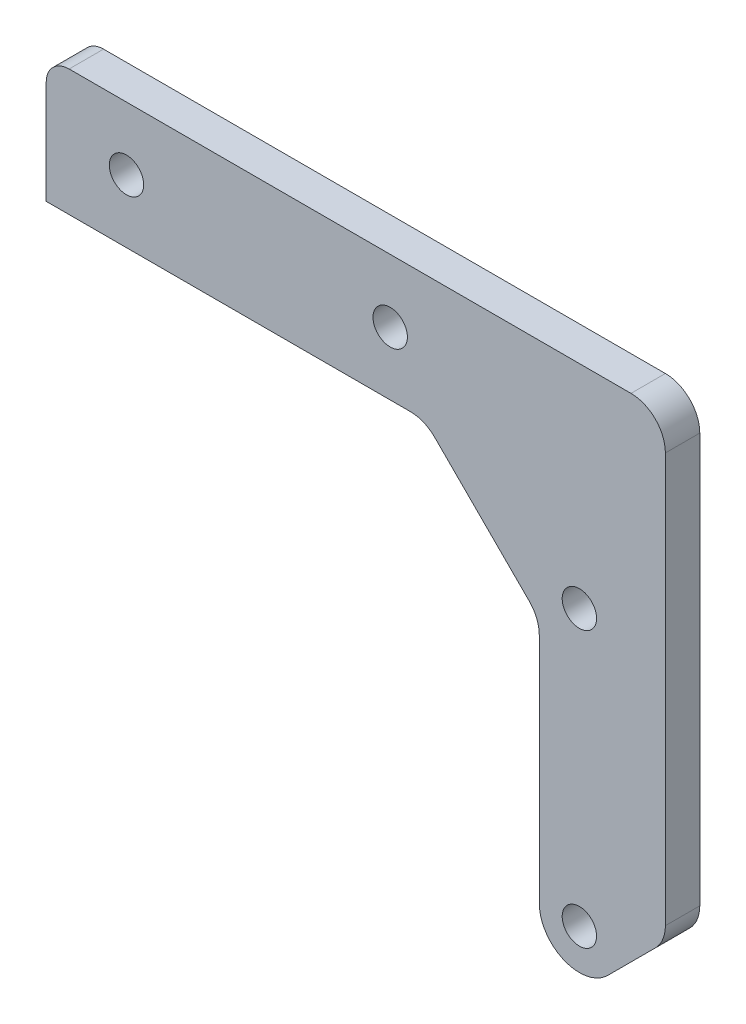
ISO-10303-21;
HEADER;
FILE_DESCRIPTION(('STEP AP214'),'2;1');
FILE_NAME('part.step','',(''),(''),'','','');
FILE_SCHEMA(('AUTOMOTIVE_DESIGN { 1 0 10303 214 1 1 1 1 }'));
ENDSEC;
DATA;
#1=APPLICATION_CONTEXT('core data for automotive mechanical design processes');
#2=APPLICATION_PROTOCOL_DEFINITION('international standard','automotive_design',2000,#1);
#3=PRODUCT_CONTEXT('',#1,'mechanical');
#4=PRODUCT('Part','Part','',(#3));
#5=PRODUCT_RELATED_PRODUCT_CATEGORY('part','',(#4));
#6=PRODUCT_DEFINITION_FORMATION('','',#4);
#7=PRODUCT_DEFINITION_CONTEXT('part definition',#1,'design');
#8=PRODUCT_DEFINITION('design','',#6,#7);
#9=PRODUCT_DEFINITION_SHAPE('','',#8);
#10=(LENGTH_UNIT() NAMED_UNIT(*) SI_UNIT(.MILLI.,.METRE.));
#11=(NAMED_UNIT(*) PLANE_ANGLE_UNIT() SI_UNIT($,.RADIAN.));
#12=(NAMED_UNIT(*) SI_UNIT($,.STERADIAN.) SOLID_ANGLE_UNIT());
#13=UNCERTAINTY_MEASURE_WITH_UNIT(LENGTH_MEASURE(1.E-05),#10,'distance_accuracy_value','');
#14=(GEOMETRIC_REPRESENTATION_CONTEXT(3) GLOBAL_UNCERTAINTY_ASSIGNED_CONTEXT((#13)) GLOBAL_UNIT_ASSIGNED_CONTEXT((#10,
#11,#12)) REPRESENTATION_CONTEXT('',''));
#15=CARTESIAN_POINT('',(0.,0.,0.));
#16=DIRECTION('',(0.,0.,1.));
#17=DIRECTION('',(1.,0.,0.));
#18=AXIS2_PLACEMENT_3D('',#15,#16,#17);
#19=CARTESIAN_POINT('',(-2.,-37.,3.));
#20=DIRECTION('',(0.,0.,1.));
#21=DIRECTION('',(1.,0.,0.));
#22=AXIS2_PLACEMENT_3D('',#19,#20,#21);
#23=PLANE('',#22);
#24=CARTESIAN_POINT('',(-2.,-13.,3.));
#25=DIRECTION('',(0.,0.,1.));
#26=DIRECTION('',(1.,0.,0.));
#27=AXIS2_PLACEMENT_3D('',#24,#25,#26);
#28=CIRCLE('',#27,1.5);
#29=CARTESIAN_POINT('',(-0.500000000000002,-13.,3.));
#30=VERTEX_POINT('',#29);
#31=EDGE_CURVE('E288',#30,#30,#28,.T.);
#32=ORIENTED_EDGE('',*,*,#31,.F.);
#33=EDGE_LOOP('',(#32));
#34=FACE_BOUND('',#33,.T.);
#35=CARTESIAN_POINT('',(-18.5,0.,3.));
#36=DIRECTION('',(0.,0.,1.));
#37=DIRECTION('',(1.,0.,0.));
#38=AXIS2_PLACEMENT_3D('',#35,#36,#37);
#39=CIRCLE('',#38,1.5);
#40=CARTESIAN_POINT('',(-17.,0.,3.));
#41=VERTEX_POINT('',#40);
#42=EDGE_CURVE('E178',#41,#41,#39,.T.);
#43=ORIENTED_EDGE('',*,*,#42,.F.);
#44=EDGE_LOOP('',(#43));
#45=FACE_BOUND('',#44,.T.);
#46=DIRECTION('',(-1.,0.,0.));
#47=VECTOR('',#46,1.);
#48=CARTESIAN_POINT('',(5.50000000000001,5.5,3.));
#49=LINE('',#48,#47);
#50=CARTESIAN_POINT('',(2.5,5.5,3.));
#51=VERTEX_POINT('',#50);
#52=CARTESIAN_POINT('',(-46.5,5.5,3.));
#53=VERTEX_POINT('',#52);
#54=EDGE_CURVE('E144',#51,#53,#49,.T.);
#55=ORIENTED_EDGE('',*,*,#54,.T.);
#56=CARTESIAN_POINT('',(-46.5,3.5,3.));
#57=DIRECTION('',(0.,0.,1.));
#58=DIRECTION('',(1.,0.,0.));
#59=AXIS2_PLACEMENT_3D('',#56,#57,#58);
#60=CIRCLE('',#59,2.);
#61=CARTESIAN_POINT('',(-48.5,3.5,3.));
#62=VERTEX_POINT('',#61);
#63=EDGE_CURVE('E11',#53,#62,#60,.T.);
#64=ORIENTED_EDGE('',*,*,#63,.T.);
#65=DIRECTION('',(0.,-1.,0.));
#66=VECTOR('',#65,1.);
#67=CARTESIAN_POINT('',(-48.5,5.5,3.));
#68=LINE('',#67,#66);
#69=CARTESIAN_POINT('',(-48.5,-5.5,3.));
#70=VERTEX_POINT('',#69);
#71=EDGE_CURVE('E134',#62,#70,#68,.T.);
#72=ORIENTED_EDGE('',*,*,#71,.T.);
#73=DIRECTION('',(1.,0.,0.));
#74=VECTOR('',#73,1.);
#75=CARTESIAN_POINT('',(-48.5,-5.5,3.));
#76=LINE('',#75,#74);
#77=CARTESIAN_POINT('',(-16.7426406871193,-5.5,3.));
#78=VERTEX_POINT('',#77);
#79=EDGE_CURVE('E138',#70,#78,#76,.T.);
#80=ORIENTED_EDGE('',*,*,#79,.T.);
#81=CARTESIAN_POINT('',(-16.7426406871193,-8.5,3.));
#82=DIRECTION('',(0.,0.,1.));
#83=DIRECTION('',(1.,0.,0.));
#84=AXIS2_PLACEMENT_3D('',#81,#82,#83);
#85=CIRCLE('',#84,3.);
#86=CARTESIAN_POINT('',(-14.6213203435596,-6.37867965644036,3.));
#87=VERTEX_POINT('',#86);
#88=EDGE_CURVE('E231',#78,#87,#85,.F.);
#89=ORIENTED_EDGE('',*,*,#88,.T.);
#90=DIRECTION('',(0.707106781186549,-0.707106781186546,0.));
#91=VECTOR('',#90,1.);
#92=CARTESIAN_POINT('',(-15.5,-5.5,3.));
#93=LINE('',#92,#91);
#94=CARTESIAN_POINT('',(-6.37867965644036,-14.6213203435596,3.));
#95=VERTEX_POINT('',#94);
#96=EDGE_CURVE('E159',#87,#95,#93,.T.);
#97=ORIENTED_EDGE('',*,*,#96,.T.);
#98=CARTESIAN_POINT('',(-8.5,-16.7426406871192,3.));
#99=DIRECTION('',(0.,0.,1.));
#100=DIRECTION('',(1.,0.,0.));
#101=AXIS2_PLACEMENT_3D('',#98,#99,#100);
#102=CIRCLE('',#101,3.);
#103=CARTESIAN_POINT('',(-5.5,-16.7426406871192,3.));
#104=VERTEX_POINT('',#103);
#105=EDGE_CURVE('E227',#95,#104,#102,.F.);
#106=ORIENTED_EDGE('',*,*,#105,.T.);
#107=DIRECTION('',(0.,-1.,0.));
#108=VECTOR('',#107,1.);
#109=CARTESIAN_POINT('',(-5.5,-15.5,3.));
#110=LINE('',#109,#108);
#111=CARTESIAN_POINT('',(-5.49999999999999,-37.,3.));
#112=VERTEX_POINT('',#111);
#113=EDGE_CURVE('E162',#104,#112,#110,.T.);
#114=ORIENTED_EDGE('',*,*,#113,.T.);
#115=CARTESIAN_POINT('',(-2.,-37.,3.));
#116=DIRECTION('',(0.,0.,1.));
#117=DIRECTION('',(1.,0.,0.));
#118=AXIS2_PLACEMENT_3D('',#115,#116,#117);
#119=CIRCLE('',#118,3.49999999999999);
#120=CARTESIAN_POINT('',(0.474873734152917,-39.4748737341529,3.));
#121=VERTEX_POINT('',#120);
#122=EDGE_CURVE('E167',#112,#121,#119,.T.);
#123=ORIENTED_EDGE('',*,*,#122,.T.);
#124=DIRECTION('',(0.707106781186546,0.707106781186549,0.));
#125=VECTOR('',#124,1.);
#126=CARTESIAN_POINT('',(0.474873734152921,-39.4748737341529,3.));
#127=LINE('',#126,#125);
#128=CARTESIAN_POINT('',(4.62132034355965,-35.3284271247462,3.));
#129=VERTEX_POINT('',#128);
#130=EDGE_CURVE('E169',#121,#129,#127,.T.);
#131=ORIENTED_EDGE('',*,*,#130,.T.);
#132=CARTESIAN_POINT('',(2.50000000000001,-33.2071067811865,3.));
#133=DIRECTION('',(0.,0.,1.));
#134=DIRECTION('',(1.,0.,0.));
#135=AXIS2_PLACEMENT_3D('',#132,#133,#134);
#136=CIRCLE('',#135,3.);
#137=CARTESIAN_POINT('',(5.50000000000001,-33.2071067811865,3.));
#138=VERTEX_POINT('',#137);
#139=EDGE_CURVE('E210',#129,#138,#136,.T.);
#140=ORIENTED_EDGE('',*,*,#139,.T.);
#141=DIRECTION('',(0.,1.,0.));
#142=VECTOR('',#141,1.);
#143=CARTESIAN_POINT('',(5.50000000000001,-34.4497474683058,3.));
#144=LINE('',#143,#142);
#145=CARTESIAN_POINT('',(5.50000000000001,2.49999999999999,3.));
#146=VERTEX_POINT('',#145);
#147=EDGE_CURVE('E172',#138,#146,#144,.T.);
#148=ORIENTED_EDGE('',*,*,#147,.T.);
#149=CARTESIAN_POINT('',(2.5,2.5,3.));
#150=DIRECTION('',(0.,0.,1.));
#151=DIRECTION('',(1.,0.,0.));
#152=AXIS2_PLACEMENT_3D('',#149,#150,#151);
#153=CIRCLE('',#152,3.);
#154=EDGE_CURVE('E212',#146,#51,#153,.T.);
#155=ORIENTED_EDGE('',*,*,#154,.T.);
#156=EDGE_LOOP('',(#55,#64,#72,#80,#89,#97,#106,#114,#123,#131,#140,#148,#155));
#157=FACE_BOUND('',#156,.T.);
#158=CARTESIAN_POINT('',(-41.5,0.,3.));
#159=DIRECTION('',(0.,0.,1.));
#160=DIRECTION('',(1.,0.,0.));
#161=AXIS2_PLACEMENT_3D('',#158,#159,#160);
#162=CIRCLE('',#161,1.5);
#163=CARTESIAN_POINT('',(-40.,0.,3.));
#164=VERTEX_POINT('',#163);
#165=EDGE_CURVE('E282',#164,#164,#162,.T.);
#166=ORIENTED_EDGE('',*,*,#165,.F.);
#167=EDGE_LOOP('',(#166));
#168=FACE_BOUND('',#167,.T.);
#169=CARTESIAN_POINT('',(-2.,-37.,3.));
#170=DIRECTION('',(0.,0.,1.));
#171=DIRECTION('',(1.,0.,0.));
#172=AXIS2_PLACEMENT_3D('',#169,#170,#171);
#173=CIRCLE('',#172,1.5);
#174=CARTESIAN_POINT('',(-0.499999999999997,-37.,3.));
#175=VERTEX_POINT('',#174);
#176=EDGE_CURVE('E294',#175,#175,#173,.T.);
#177=ORIENTED_EDGE('',*,*,#176,.F.);
#178=EDGE_LOOP('',(#177));
#179=FACE_BOUND('',#178,.T.);
#180=ADVANCED_FACE('F39',(#34,#45,#157,#168,#179),#23,.T.);
#181=CARTESIAN_POINT('',(-2.,-37.,0.));
#182=DIRECTION('',(0.,0.,1.));
#183=DIRECTION('',(1.,0.,0.));
#184=AXIS2_PLACEMENT_3D('',#181,#182,#183);
#185=PLANE('',#184);
#186=DIRECTION('',(0.,-1.,0.));
#187=VECTOR('',#186,1.);
#188=CARTESIAN_POINT('',(-48.5,5.5,0.));
#189=LINE('',#188,#187);
#190=CARTESIAN_POINT('',(-48.5,3.5,0.));
#191=VERTEX_POINT('',#190);
#192=CARTESIAN_POINT('',(-48.5,-5.5,0.));
#193=VERTEX_POINT('',#192);
#194=EDGE_CURVE('E149',#191,#193,#189,.T.);
#195=ORIENTED_EDGE('',*,*,#194,.F.);
#196=CARTESIAN_POINT('',(-46.5,3.5,0.));
#197=DIRECTION('',(0.,0.,1.));
#198=DIRECTION('',(1.,0.,0.));
#199=AXIS2_PLACEMENT_3D('',#196,#197,#198);
#200=CIRCLE('',#199,2.);
#201=CARTESIAN_POINT('',(-46.5,5.5,0.));
#202=VERTEX_POINT('',#201);
#203=EDGE_CURVE('E61',#191,#202,#200,.F.);
#204=ORIENTED_EDGE('',*,*,#203,.T.);
#205=DIRECTION('',(-1.,0.,0.));
#206=VECTOR('',#205,1.);
#207=CARTESIAN_POINT('',(5.50000000000001,5.5,0.));
#208=LINE('',#207,#206);
#209=CARTESIAN_POINT('',(2.5,5.5,0.));
#210=VERTEX_POINT('',#209);
#211=EDGE_CURVE('E176',#210,#202,#208,.T.);
#212=ORIENTED_EDGE('',*,*,#211,.F.);
#213=CARTESIAN_POINT('',(2.5,2.5,0.));
#214=DIRECTION('',(0.,0.,1.));
#215=DIRECTION('',(1.,0.,0.));
#216=AXIS2_PLACEMENT_3D('',#213,#214,#215);
#217=CIRCLE('',#216,3.);
#218=CARTESIAN_POINT('',(5.50000000000001,2.49999999999999,0.));
#219=VERTEX_POINT('',#218);
#220=EDGE_CURVE('E203',#210,#219,#217,.F.);
#221=ORIENTED_EDGE('',*,*,#220,.T.);
#222=DIRECTION('',(0.,1.,0.));
#223=VECTOR('',#222,1.);
#224=CARTESIAN_POINT('',(5.50000000000001,-34.4497474683058,0.));
#225=LINE('',#224,#223);
#226=CARTESIAN_POINT('',(5.50000000000001,-33.2071067811865,0.));
#227=VERTEX_POINT('',#226);
#228=EDGE_CURVE('E192',#227,#219,#225,.T.);
#229=ORIENTED_EDGE('',*,*,#228,.F.);
#230=CARTESIAN_POINT('',(2.50000000000001,-33.2071067811865,0.));
#231=DIRECTION('',(0.,0.,1.));
#232=DIRECTION('',(1.,0.,0.));
#233=AXIS2_PLACEMENT_3D('',#230,#231,#232);
#234=CIRCLE('',#233,3.);
#235=CARTESIAN_POINT('',(4.62132034355965,-35.3284271247462,0.));
#236=VERTEX_POINT('',#235);
#237=EDGE_CURVE('E201',#227,#236,#234,.F.);
#238=ORIENTED_EDGE('',*,*,#237,.T.);
#239=DIRECTION('',(0.707106781186546,0.707106781186549,0.));
#240=VECTOR('',#239,1.);
#241=CARTESIAN_POINT('',(0.474873734152921,-39.4748737341529,0.));
#242=LINE('',#241,#240);
#243=CARTESIAN_POINT('',(0.474873734152917,-39.4748737341529,0.));
#244=VERTEX_POINT('',#243);
#245=EDGE_CURVE('E189',#244,#236,#242,.T.);
#246=ORIENTED_EDGE('',*,*,#245,.F.);
#247=CARTESIAN_POINT('',(-2.,-37.,0.));
#248=DIRECTION('',(0.,0.,1.));
#249=DIRECTION('',(1.,0.,0.));
#250=AXIS2_PLACEMENT_3D('',#247,#248,#249);
#251=CIRCLE('',#250,3.49999999999999);
#252=CARTESIAN_POINT('',(-5.49999999999999,-37.,0.));
#253=VERTEX_POINT('',#252);
#254=EDGE_CURVE('E187',#253,#244,#251,.T.);
#255=ORIENTED_EDGE('',*,*,#254,.F.);
#256=DIRECTION('',(0.,-1.,0.));
#257=VECTOR('',#256,1.);
#258=CARTESIAN_POINT('',(-5.5,-15.5,0.));
#259=LINE('',#258,#257);
#260=CARTESIAN_POINT('',(-5.5,-16.7426406871192,0.));
#261=VERTEX_POINT('',#260);
#262=EDGE_CURVE('E185',#261,#253,#259,.T.);
#263=ORIENTED_EDGE('',*,*,#262,.F.);
#264=CARTESIAN_POINT('',(-8.5,-16.7426406871192,0.));
#265=DIRECTION('',(0.,0.,1.));
#266=DIRECTION('',(1.,0.,0.));
#267=AXIS2_PLACEMENT_3D('',#264,#265,#266);
#268=CIRCLE('',#267,3.);
#269=CARTESIAN_POINT('',(-6.37867965644036,-14.6213203435596,0.));
#270=VERTEX_POINT('',#269);
#271=EDGE_CURVE('E225',#261,#270,#268,.T.);
#272=ORIENTED_EDGE('',*,*,#271,.T.);
#273=DIRECTION('',(0.707106781186549,-0.707106781186546,0.));
#274=VECTOR('',#273,1.);
#275=CARTESIAN_POINT('',(-15.5,-5.5,0.));
#276=LINE('',#275,#274);
#277=CARTESIAN_POINT('',(-14.6213203435596,-6.37867965644036,0.));
#278=VERTEX_POINT('',#277);
#279=EDGE_CURVE('E182',#278,#270,#276,.T.);
#280=ORIENTED_EDGE('',*,*,#279,.F.);
#281=CARTESIAN_POINT('',(-16.7426406871193,-8.5,0.));
#282=DIRECTION('',(0.,0.,1.));
#283=DIRECTION('',(1.,0.,0.));
#284=AXIS2_PLACEMENT_3D('',#281,#282,#283);
#285=CIRCLE('',#284,3.);
#286=CARTESIAN_POINT('',(-16.7426406871193,-5.5,0.));
#287=VERTEX_POINT('',#286);
#288=EDGE_CURVE('E229',#278,#287,#285,.T.);
#289=ORIENTED_EDGE('',*,*,#288,.T.);
#290=DIRECTION('',(1.,0.,0.));
#291=VECTOR('',#290,1.);
#292=CARTESIAN_POINT('',(-48.5,-5.5,0.));
#293=LINE('',#292,#291);
#294=EDGE_CURVE('E180',#193,#287,#293,.T.);
#295=ORIENTED_EDGE('',*,*,#294,.F.);
#296=EDGE_LOOP('',(#195,#204,#212,#221,#229,#238,#246,#255,#263,#272,#280,#289,#295));
#297=FACE_BOUND('',#296,.T.);
#298=CARTESIAN_POINT('',(-18.5,0.,0.));
#299=DIRECTION('',(0.,0.,1.));
#300=DIRECTION('',(1.,0.,0.));
#301=AXIS2_PLACEMENT_3D('',#298,#299,#300);
#302=CIRCLE('',#301,1.5);
#303=CARTESIAN_POINT('',(-17.,0.,0.));
#304=VERTEX_POINT('',#303);
#305=EDGE_CURVE('E279',#304,#304,#302,.T.);
#306=ORIENTED_EDGE('',*,*,#305,.T.);
#307=EDGE_LOOP('',(#306));
#308=FACE_BOUND('',#307,.T.);
#309=CARTESIAN_POINT('',(-41.5,0.,0.));
#310=DIRECTION('',(0.,0.,1.));
#311=DIRECTION('',(1.,0.,0.));
#312=AXIS2_PLACEMENT_3D('',#309,#310,#311);
#313=CIRCLE('',#312,1.5);
#314=CARTESIAN_POINT('',(-40.,0.,0.));
#315=VERTEX_POINT('',#314);
#316=EDGE_CURVE('E285',#315,#315,#313,.T.);
#317=ORIENTED_EDGE('',*,*,#316,.T.);
#318=EDGE_LOOP('',(#317));
#319=FACE_BOUND('',#318,.T.);
#320=CARTESIAN_POINT('',(-2.,-13.,0.));
#321=DIRECTION('',(0.,0.,1.));
#322=DIRECTION('',(1.,0.,0.));
#323=AXIS2_PLACEMENT_3D('',#320,#321,#322);
#324=CIRCLE('',#323,1.5);
#325=CARTESIAN_POINT('',(-0.500000000000002,-13.,0.));
#326=VERTEX_POINT('',#325);
#327=EDGE_CURVE('E291',#326,#326,#324,.T.);
#328=ORIENTED_EDGE('',*,*,#327,.T.);
#329=EDGE_LOOP('',(#328));
#330=FACE_BOUND('',#329,.T.);
#331=CARTESIAN_POINT('',(-2.,-37.,0.));
#332=DIRECTION('',(0.,0.,1.));
#333=DIRECTION('',(1.,0.,0.));
#334=AXIS2_PLACEMENT_3D('',#331,#332,#333);
#335=CIRCLE('',#334,1.5);
#336=CARTESIAN_POINT('',(-0.499999999999997,-37.,0.));
#337=VERTEX_POINT('',#336);
#338=EDGE_CURVE('E297',#337,#337,#335,.T.);
#339=ORIENTED_EDGE('',*,*,#338,.T.);
#340=EDGE_LOOP('',(#339));
#341=FACE_BOUND('',#340,.T.);
#342=ADVANCED_FACE('F236',(#297,#308,#319,#330,#341),#185,.F.);
#343=CARTESIAN_POINT('',(5.50000000000001,5.5,3.));
#344=DIRECTION('',(0.,-1.,0.));
#345=DIRECTION('',(1.,0.,0.));
#346=AXIS2_PLACEMENT_3D('',#343,#344,#345);
#347=PLANE('',#346);
#348=ORIENTED_EDGE('',*,*,#211,.T.);
#349=DIRECTION('',(0.,0.,-1.));
#350=VECTOR('',#349,1.);
#351=CARTESIAN_POINT('',(-46.5,5.5,3.));
#352=LINE('',#351,#350);
#353=EDGE_CURVE('E47',#202,#53,#352,.F.);
#354=ORIENTED_EDGE('',*,*,#353,.T.);
#355=ORIENTED_EDGE('',*,*,#54,.F.);
#356=DIRECTION('',(0.,0.,-1.));
#357=VECTOR('',#356,1.);
#358=CARTESIAN_POINT('',(2.5,5.5,3.));
#359=LINE('',#358,#357);
#360=EDGE_CURVE('E153',#51,#210,#359,.T.);
#361=ORIENTED_EDGE('',*,*,#360,.T.);
#362=EDGE_LOOP('',(#348,#354,#355,#361));
#363=FACE_BOUND('',#362,.T.);
#364=ADVANCED_FACE('F277',(#363),#347,.F.);
#365=CARTESIAN_POINT('',(-48.5,5.5,3.));
#366=DIRECTION('',(1.,0.,0.));
#367=DIRECTION('',(0.,0.,-1.));
#368=AXIS2_PLACEMENT_3D('',#365,#366,#367);
#369=PLANE('',#368);
#370=ORIENTED_EDGE('',*,*,#71,.F.);
#371=DIRECTION('',(0.,0.,-1.));
#372=VECTOR('',#371,1.);
#373=CARTESIAN_POINT('',(-48.5,3.5,3.));
#374=LINE('',#373,#372);
#375=EDGE_CURVE('E233',#62,#191,#374,.T.);
#376=ORIENTED_EDGE('',*,*,#375,.T.);
#377=ORIENTED_EDGE('',*,*,#194,.T.);
#378=DIRECTION('',(0.,0.,-1.));
#379=VECTOR('',#378,1.);
#380=CARTESIAN_POINT('',(-48.5,-5.5,3.));
#381=LINE('',#380,#379);
#382=EDGE_CURVE('E147',#70,#193,#381,.T.);
#383=ORIENTED_EDGE('',*,*,#382,.F.);
#384=EDGE_LOOP('',(#370,#376,#377,#383));
#385=FACE_BOUND('',#384,.T.);
#386=ADVANCED_FACE('F148',(#385),#369,.F.);
#387=CARTESIAN_POINT('',(-48.5,-5.5,3.));
#388=DIRECTION('',(0.,1.,0.));
#389=DIRECTION('',(0.,0.,1.));
#390=AXIS2_PLACEMENT_3D('',#387,#388,#389);
#391=PLANE('',#390);
#392=ORIENTED_EDGE('',*,*,#294,.T.);
#393=DIRECTION('',(0.,0.,-1.));
#394=VECTOR('',#393,1.);
#395=CARTESIAN_POINT('',(-16.7426406871193,-5.5,3.));
#396=LINE('',#395,#394);
#397=EDGE_CURVE('E158',#287,#78,#396,.F.);
#398=ORIENTED_EDGE('',*,*,#397,.T.);
#399=ORIENTED_EDGE('',*,*,#79,.F.);
#400=ORIENTED_EDGE('',*,*,#382,.T.);
#401=EDGE_LOOP('',(#392,#398,#399,#400));
#402=FACE_BOUND('',#401,.T.);
#403=ADVANCED_FACE('F156',(#402),#391,.F.);
#404=CARTESIAN_POINT('',(-15.5,-5.5,3.));
#405=DIRECTION('',(0.707106781186546,0.707106781186549,0.));
#406=DIRECTION('',(-0.707106781186549,0.707106781186546,0.));
#407=AXIS2_PLACEMENT_3D('',#404,#405,#406);
#408=PLANE('',#407);
#409=ORIENTED_EDGE('',*,*,#279,.T.);
#410=DIRECTION('',(0.,0.,-1.));
#411=VECTOR('',#410,1.);
#412=CARTESIAN_POINT('',(-6.37867965644036,-14.6213203435596,3.));
#413=LINE('',#412,#411);
#414=EDGE_CURVE('E222',#270,#95,#413,.F.);
#415=ORIENTED_EDGE('',*,*,#414,.T.);
#416=ORIENTED_EDGE('',*,*,#96,.F.);
#417=DIRECTION('',(0.,0.,-1.));
#418=VECTOR('',#417,1.);
#419=CARTESIAN_POINT('',(-14.6213203435596,-6.37867965644036,0.));
#420=LINE('',#419,#418);
#421=EDGE_CURVE('E219',#87,#278,#420,.T.);
#422=ORIENTED_EDGE('',*,*,#421,.T.);
#423=EDGE_LOOP('',(#409,#415,#416,#422));
#424=FACE_BOUND('',#423,.T.);
#425=ADVANCED_FACE('F245',(#424),#408,.F.);
#426=CARTESIAN_POINT('',(-5.5,-15.5,3.));
#427=DIRECTION('',(1.,0.,0.));
#428=DIRECTION('',(0.,1.,0.));
#429=AXIS2_PLACEMENT_3D('',#426,#427,#428);
#430=PLANE('',#429);
#431=ORIENTED_EDGE('',*,*,#113,.F.);
#432=DIRECTION('',(0.,0.,-1.));
#433=VECTOR('',#432,1.);
#434=CARTESIAN_POINT('',(-5.5,-16.7426406871192,0.));
#435=LINE('',#434,#433);
#436=EDGE_CURVE('E216',#104,#261,#435,.T.);
#437=ORIENTED_EDGE('',*,*,#436,.T.);
#438=ORIENTED_EDGE('',*,*,#262,.T.);
#439=DIRECTION('',(0.,0.,-1.));
#440=VECTOR('',#439,1.);
#441=CARTESIAN_POINT('',(-5.49999999999999,-37.,3.));
#442=LINE('',#441,#440);
#443=EDGE_CURVE('E154',#112,#253,#442,.T.);
#444=ORIENTED_EDGE('',*,*,#443,.F.);
#445=EDGE_LOOP('',(#431,#437,#438,#444));
#446=FACE_BOUND('',#445,.T.);
#447=ADVANCED_FACE('F253',(#446),#430,.F.);
#448=CARTESIAN_POINT('',(-2.,-37.,3.));
#449=DIRECTION('',(0.,0.,-1.));
#450=DIRECTION('',(-1.,0.,0.));
#451=AXIS2_PLACEMENT_3D('',#448,#449,#450);
#452=CYLINDRICAL_SURFACE('',#451,3.49999999999999);
#453=ORIENTED_EDGE('',*,*,#254,.T.);
#454=DIRECTION('',(0.,0.,-1.));
#455=VECTOR('',#454,1.);
#456=CARTESIAN_POINT('',(0.474873734152917,-39.4748737341529,3.));
#457=LINE('',#456,#455);
#458=EDGE_CURVE('E175',#121,#244,#457,.T.);
#459=ORIENTED_EDGE('',*,*,#458,.F.);
#460=ORIENTED_EDGE('',*,*,#122,.F.);
#461=ORIENTED_EDGE('',*,*,#443,.T.);
#462=EDGE_LOOP('',(#453,#459,#460,#461));
#463=FACE_BOUND('',#462,.T.);
#464=ADVANCED_FACE('F259',(#463),#452,.T.);
#465=CARTESIAN_POINT('',(0.474873734152921,-39.4748737341529,3.));
#466=DIRECTION('',(-0.707106781186549,0.707106781186546,0.));
#467=DIRECTION('',(-0.707106781186546,-0.707106781186549,0.));
#468=AXIS2_PLACEMENT_3D('',#465,#466,#467);
#469=PLANE('',#468);
#470=ORIENTED_EDGE('',*,*,#245,.T.);
#471=DIRECTION('',(0.,0.,-1.));
#472=VECTOR('',#471,1.);
#473=CARTESIAN_POINT('',(4.62132034355965,-35.3284271247462,3.));
#474=LINE('',#473,#472);
#475=EDGE_CURVE('E214',#236,#129,#474,.F.);
#476=ORIENTED_EDGE('',*,*,#475,.T.);
#477=ORIENTED_EDGE('',*,*,#130,.F.);
#478=ORIENTED_EDGE('',*,*,#458,.T.);
#479=EDGE_LOOP('',(#470,#476,#477,#478));
#480=FACE_BOUND('',#479,.T.);
#481=ADVANCED_FACE('F321',(#480),#469,.F.);
#482=CARTESIAN_POINT('',(5.50000000000001,-34.4497474683058,3.));
#483=DIRECTION('',(-1.,0.,0.));
#484=DIRECTION('',(0.,-1.,0.));
#485=AXIS2_PLACEMENT_3D('',#482,#483,#484);
#486=PLANE('',#485);
#487=ORIENTED_EDGE('',*,*,#228,.T.);
#488=DIRECTION('',(0.,0.,-1.));
#489=VECTOR('',#488,1.);
#490=CARTESIAN_POINT('',(5.50000000000001,2.5,3.));
#491=LINE('',#490,#489);
#492=EDGE_CURVE('E208',#219,#146,#491,.F.);
#493=ORIENTED_EDGE('',*,*,#492,.T.);
#494=ORIENTED_EDGE('',*,*,#147,.F.);
#495=DIRECTION('',(0.,0.,-1.));
#496=VECTOR('',#495,1.);
#497=CARTESIAN_POINT('',(5.50000000000001,-33.2071067811865,3.));
#498=LINE('',#497,#496);
#499=EDGE_CURVE('E205',#138,#227,#498,.T.);
#500=ORIENTED_EDGE('',*,*,#499,.T.);
#501=EDGE_LOOP('',(#487,#493,#494,#500));
#502=FACE_BOUND('',#501,.T.);
#503=ADVANCED_FACE('F270',(#502),#486,.F.);
#504=CARTESIAN_POINT('',(-18.5,0.,3.));
#505=DIRECTION('',(0.,0.,-1.));
#506=DIRECTION('',(-1.,0.,0.));
#507=AXIS2_PLACEMENT_3D('',#504,#505,#506);
#508=CYLINDRICAL_SURFACE('',#507,1.5);
#509=ORIENTED_EDGE('',*,*,#42,.T.);
#510=EDGE_LOOP('',(#509));
#511=FACE_BOUND('',#510,.T.);
#512=ORIENTED_EDGE('',*,*,#305,.F.);
#513=EDGE_LOOP('',(#512));
#514=FACE_BOUND('',#513,.T.);
#515=ADVANCED_FACE('F316',(#511,#514),#508,.F.);
#516=CARTESIAN_POINT('',(-41.5,0.,3.));
#517=DIRECTION('',(0.,0.,-1.));
#518=DIRECTION('',(-1.,0.,0.));
#519=AXIS2_PLACEMENT_3D('',#516,#517,#518);
#520=CYLINDRICAL_SURFACE('',#519,1.5);
#521=ORIENTED_EDGE('',*,*,#165,.T.);
#522=EDGE_LOOP('',(#521));
#523=FACE_BOUND('',#522,.T.);
#524=ORIENTED_EDGE('',*,*,#316,.F.);
#525=EDGE_LOOP('',(#524));
#526=FACE_BOUND('',#525,.T.);
#527=ADVANCED_FACE('F361',(#523,#526),#520,.F.);
#528=CARTESIAN_POINT('',(-2.,-13.,3.));
#529=DIRECTION('',(0.,0.,-1.));
#530=DIRECTION('',(-1.,0.,0.));
#531=AXIS2_PLACEMENT_3D('',#528,#529,#530);
#532=CYLINDRICAL_SURFACE('',#531,1.5);
#533=ORIENTED_EDGE('',*,*,#31,.T.);
#534=EDGE_LOOP('',(#533));
#535=FACE_BOUND('',#534,.T.);
#536=ORIENTED_EDGE('',*,*,#327,.F.);
#537=EDGE_LOOP('',(#536));
#538=FACE_BOUND('',#537,.T.);
#539=ADVANCED_FACE('F370',(#535,#538),#532,.F.);
#540=CARTESIAN_POINT('',(-2.,-37.,3.));
#541=DIRECTION('',(0.,0.,-1.));
#542=DIRECTION('',(-1.,0.,0.));
#543=AXIS2_PLACEMENT_3D('',#540,#541,#542);
#544=CYLINDRICAL_SURFACE('',#543,1.5);
#545=ORIENTED_EDGE('',*,*,#176,.T.);
#546=EDGE_LOOP('',(#545));
#547=FACE_BOUND('',#546,.T.);
#548=ORIENTED_EDGE('',*,*,#338,.F.);
#549=EDGE_LOOP('',(#548));
#550=FACE_BOUND('',#549,.T.);
#551=ADVANCED_FACE('F303',(#547,#550),#544,.F.);
#552=CARTESIAN_POINT('',(2.5,2.5,3.));
#553=DIRECTION('',(0.,0.,-1.));
#554=DIRECTION('',(-1.,0.,0.));
#555=AXIS2_PLACEMENT_3D('',#552,#553,#554);
#556=CYLINDRICAL_SURFACE('',#555,3.);
#557=ORIENTED_EDGE('',*,*,#154,.F.);
#558=ORIENTED_EDGE('',*,*,#492,.F.);
#559=ORIENTED_EDGE('',*,*,#220,.F.);
#560=ORIENTED_EDGE('',*,*,#360,.F.);
#561=EDGE_LOOP('',(#557,#558,#559,#560));
#562=FACE_BOUND('',#561,.T.);
#563=ADVANCED_FACE('F276',(#562),#556,.T.);
#564=CARTESIAN_POINT('',(2.50000000000001,-33.2071067811865,3.));
#565=DIRECTION('',(0.,0.,-1.));
#566=DIRECTION('',(-1.,0.,0.));
#567=AXIS2_PLACEMENT_3D('',#564,#565,#566);
#568=CYLINDRICAL_SURFACE('',#567,3.);
#569=ORIENTED_EDGE('',*,*,#139,.F.);
#570=ORIENTED_EDGE('',*,*,#475,.F.);
#571=ORIENTED_EDGE('',*,*,#237,.F.);
#572=ORIENTED_EDGE('',*,*,#499,.F.);
#573=EDGE_LOOP('',(#569,#570,#571,#572));
#574=FACE_BOUND('',#573,.T.);
#575=ADVANCED_FACE('F267',(#574),#568,.T.);
#576=CARTESIAN_POINT('',(-8.5,-16.7426406871192,3.));
#577=DIRECTION('',(0.,0.,1.));
#578=DIRECTION('',(1.,0.,0.));
#579=AXIS2_PLACEMENT_3D('',#576,#577,#578);
#580=CYLINDRICAL_SURFACE('',#579,3.);
#581=ORIENTED_EDGE('',*,*,#105,.F.);
#582=ORIENTED_EDGE('',*,*,#414,.F.);
#583=ORIENTED_EDGE('',*,*,#271,.F.);
#584=ORIENTED_EDGE('',*,*,#436,.F.);
#585=EDGE_LOOP('',(#581,#582,#583,#584));
#586=FACE_BOUND('',#585,.T.);
#587=ADVANCED_FACE('F248',(#586),#580,.F.);
#588=CARTESIAN_POINT('',(-16.7426406871193,-8.5,3.));
#589=DIRECTION('',(0.,0.,1.));
#590=DIRECTION('',(1.,0.,0.));
#591=AXIS2_PLACEMENT_3D('',#588,#589,#590);
#592=CYLINDRICAL_SURFACE('',#591,3.);
#593=ORIENTED_EDGE('',*,*,#88,.F.);
#594=ORIENTED_EDGE('',*,*,#397,.F.);
#595=ORIENTED_EDGE('',*,*,#288,.F.);
#596=ORIENTED_EDGE('',*,*,#421,.F.);
#597=EDGE_LOOP('',(#593,#594,#595,#596));
#598=FACE_BOUND('',#597,.T.);
#599=ADVANCED_FACE('F240',(#598),#592,.F.);
#600=CARTESIAN_POINT('',(-46.5,3.5,3.));
#601=DIRECTION('',(0.,0.,-1.));
#602=DIRECTION('',(-1.,0.,0.));
#603=AXIS2_PLACEMENT_3D('',#600,#601,#602);
#604=CYLINDRICAL_SURFACE('',#603,2.);
#605=ORIENTED_EDGE('',*,*,#63,.F.);
#606=ORIENTED_EDGE('',*,*,#353,.F.);
#607=ORIENTED_EDGE('',*,*,#203,.F.);
#608=ORIENTED_EDGE('',*,*,#375,.F.);
#609=EDGE_LOOP('',(#605,#606,#607,#608));
#610=FACE_BOUND('',#609,.T.);
#611=ADVANCED_FACE('F41',(#610),#604,.T.);
#612=CLOSED_SHELL('',(#180,#342,#364,#386,#403,#425,#447,#464,#481,#503,#515,#527,#539,#551,
#563,#575,#587,#599,#611));
#613=MANIFOLD_SOLID_BREP('B2',#612);
#614=ADVANCED_BREP_SHAPE_REPRESENTATION('',(#18,#613),#14);
#615=SHAPE_DEFINITION_REPRESENTATION(#9,#614);
ENDSEC;
END-ISO-10303-21;
